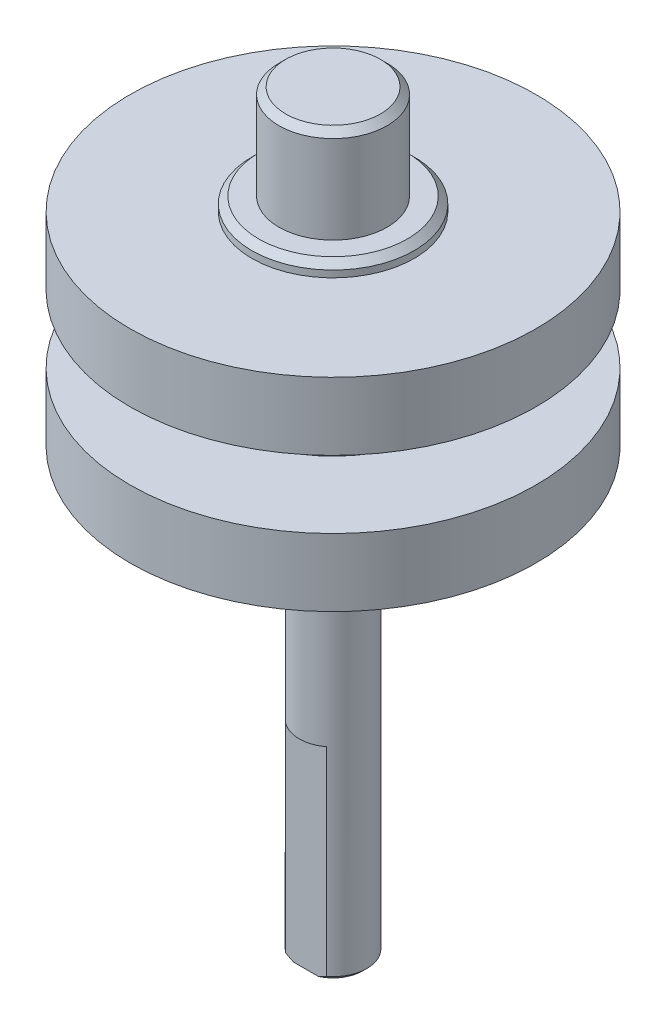
ISO-10303-21;
HEADER;
FILE_DESCRIPTION(('STEP AP214'),'2;1');
FILE_NAME('part.step','',(''),(''),'','','');
FILE_SCHEMA(('AUTOMOTIVE_DESIGN { 1 0 10303 214 1 1 1 1 }'));
ENDSEC;
DATA;
#1=APPLICATION_CONTEXT('core data for automotive mechanical design processes');
#2=APPLICATION_PROTOCOL_DEFINITION('international standard','automotive_design',2000,#1);
#3=PRODUCT_CONTEXT('',#1,'mechanical');
#4=PRODUCT('Part','Part','',(#3));
#5=PRODUCT_RELATED_PRODUCT_CATEGORY('part','',(#4));
#6=PRODUCT_DEFINITION_FORMATION('','',#4);
#7=PRODUCT_DEFINITION_CONTEXT('part definition',#1,'design');
#8=PRODUCT_DEFINITION('design','',#6,#7);
#9=PRODUCT_DEFINITION_SHAPE('','',#8);
#10=(LENGTH_UNIT() NAMED_UNIT(*) SI_UNIT(.MILLI.,.METRE.));
#11=(NAMED_UNIT(*) PLANE_ANGLE_UNIT() SI_UNIT($,.RADIAN.));
#12=(NAMED_UNIT(*) SI_UNIT($,.STERADIAN.) SOLID_ANGLE_UNIT());
#13=UNCERTAINTY_MEASURE_WITH_UNIT(LENGTH_MEASURE(1.E-05),#10,'distance_accuracy_value','');
#14=(GEOMETRIC_REPRESENTATION_CONTEXT(3) GLOBAL_UNCERTAINTY_ASSIGNED_CONTEXT((#13)) GLOBAL_UNIT_ASSIGNED_CONTEXT((#10,
#11,#12)) REPRESENTATION_CONTEXT('',''));
#15=CARTESIAN_POINT('',(0.,0.,0.));
#16=DIRECTION('',(0.,0.,1.));
#17=DIRECTION('',(1.,0.,0.));
#18=AXIS2_PLACEMENT_3D('',#15,#16,#17);
#19=CARTESIAN_POINT('',(0.,31.5,0.));
#20=DIRECTION('',(0.,1.,0.));
#21=DIRECTION('',(0.,0.,-1.));
#22=AXIS2_PLACEMENT_3D('',#19,#20,#21);
#23=PLANE('',#22);
#24=CARTESIAN_POINT('',(0.,31.5,0.));
#25=DIRECTION('',(0.,1.,0.));
#26=DIRECTION('',(0.,0.,1.));
#27=AXIS2_PLACEMENT_3D('',#24,#25,#26);
#28=CIRCLE('',#27,3.5);
#29=CARTESIAN_POINT('',(0.,31.5,3.5));
#30=VERTEX_POINT('',#29);
#31=EDGE_CURVE('E11',#30,#30,#28,.T.);
#32=ORIENTED_EDGE('',*,*,#31,.T.);
#33=EDGE_LOOP('',(#32));
#34=FACE_BOUND('',#33,.T.);
#35=ADVANCED_FACE('F17',(#34),#23,.T.);
#36=CARTESIAN_POINT('',(0.,31.5,0.));
#37=DIRECTION('',(0.,-1.,0.));
#38=DIRECTION('',(0.,0.,1.));
#39=AXIS2_PLACEMENT_3D('',#36,#37,#38);
#40=CONICAL_SURFACE('',#39,3.5,0.785398163397);
#41=DIRECTION('',(0.,-0.707106781186548,0.707106781186548));
#42=VECTOR('',#41,1.);
#43=CARTESIAN_POINT('',(0.,31.5,3.5));
#44=LINE('',#43,#42);
#45=CARTESIAN_POINT('',(0.,31.,4.));
#46=VERTEX_POINT('',#45);
#47=EDGE_CURVE('E28',#30,#46,#44,.T.);
#48=ORIENTED_EDGE('',*,*,#47,.T.);
#49=CARTESIAN_POINT('',(0.,31.,0.));
#50=DIRECTION('',(0.,1.,0.));
#51=DIRECTION('',(0.,0.,1.));
#52=AXIS2_PLACEMENT_3D('',#49,#50,#51);
#53=CIRCLE('',#52,4.);
#54=EDGE_CURVE('E228',#46,#46,#53,.T.);
#55=ORIENTED_EDGE('',*,*,#54,.T.);
#56=ORIENTED_EDGE('',*,*,#47,.F.);
#57=ORIENTED_EDGE('',*,*,#31,.F.);
#58=EDGE_LOOP('',(#48,#55,#56,#57));
#59=FACE_BOUND('',#58,.T.);
#60=ADVANCED_FACE('F318',(#59),#40,.T.);
#61=CARTESIAN_POINT('',(0.,24.5,0.));
#62=DIRECTION('',(0.,1.,0.));
#63=DIRECTION('',(0.,0.,1.));
#64=AXIS2_PLACEMENT_3D('',#61,#62,#63);
#65=CYLINDRICAL_SURFACE('',#64,4.);
#66=CARTESIAN_POINT('',(0.,24.5,0.));
#67=DIRECTION('',(0.,1.,0.));
#68=DIRECTION('',(0.,0.,1.));
#69=AXIS2_PLACEMENT_3D('',#66,#67,#68);
#70=CIRCLE('',#69,4.);
#71=CARTESIAN_POINT('',(0.,24.5,4.));
#72=VERTEX_POINT('',#71);
#73=EDGE_CURVE('E140',#72,#72,#70,.T.);
#74=ORIENTED_EDGE('',*,*,#73,.T.);
#75=DIRECTION('',(0.,1.,0.));
#76=VECTOR('',#75,1.);
#77=CARTESIAN_POINT('',(0.,24.5,4.));
#78=LINE('',#77,#76);
#79=EDGE_CURVE('E149',#72,#46,#78,.T.);
#80=ORIENTED_EDGE('',*,*,#79,.T.);
#81=ORIENTED_EDGE('',*,*,#54,.F.);
#82=ORIENTED_EDGE('',*,*,#79,.F.);
#83=EDGE_LOOP('',(#74,#80,#81,#82));
#84=FACE_BOUND('',#83,.T.);
#85=ADVANCED_FACE('F323',(#84),#65,.T.);
#86=CARTESIAN_POINT('',(0.,24.5,0.));
#87=DIRECTION('',(0.,1.,0.));
#88=DIRECTION('',(0.,0.,-1.));
#89=AXIS2_PLACEMENT_3D('',#86,#87,#88);
#90=PLANE('',#89);
#91=ORIENTED_EDGE('',*,*,#73,.F.);
#92=EDGE_LOOP('',(#91));
#93=FACE_BOUND('',#92,.T.);
#94=CARTESIAN_POINT('',(0.,24.5,0.));
#95=DIRECTION('',(0.,1.,0.));
#96=DIRECTION('',(0.,0.,1.));
#97=AXIS2_PLACEMENT_3D('',#94,#95,#96);
#98=CIRCLE('',#97,5.5);
#99=CARTESIAN_POINT('',(0.,24.5,5.5));
#100=VERTEX_POINT('',#99);
#101=EDGE_CURVE('E135',#100,#100,#98,.T.);
#102=ORIENTED_EDGE('',*,*,#101,.T.);
#103=EDGE_LOOP('',(#102));
#104=FACE_BOUND('',#103,.T.);
#105=ADVANCED_FACE('F136',(#93,#104),#90,.T.);
#106=CARTESIAN_POINT('',(0.,24.,0.));
#107=DIRECTION('',(0.,-1.,0.));
#108=DIRECTION('',(0.,0.,1.));
#109=AXIS2_PLACEMENT_3D('',#106,#107,#108);
#110=CONICAL_SURFACE('',#109,6.,0.785398163397);
#111=CARTESIAN_POINT('',(0.,24.,0.));
#112=DIRECTION('',(0.,1.,0.));
#113=DIRECTION('',(0.,0.,1.));
#114=AXIS2_PLACEMENT_3D('',#111,#112,#113);
#115=CIRCLE('',#114,6.);
#116=CARTESIAN_POINT('',(0.,24.,6.));
#117=VERTEX_POINT('',#116);
#118=EDGE_CURVE('E151',#117,#117,#115,.T.);
#119=ORIENTED_EDGE('',*,*,#118,.T.);
#120=DIRECTION('',(0.,0.707106781186548,-0.707106781186548));
#121=VECTOR('',#120,1.);
#122=CARTESIAN_POINT('',(0.,24.,6.));
#123=LINE('',#122,#121);
#124=EDGE_CURVE('E141',#117,#100,#123,.T.);
#125=ORIENTED_EDGE('',*,*,#124,.T.);
#126=ORIENTED_EDGE('',*,*,#101,.F.);
#127=ORIENTED_EDGE('',*,*,#124,.F.);
#128=EDGE_LOOP('',(#119,#125,#126,#127));
#129=FACE_BOUND('',#128,.T.);
#130=ADVANCED_FACE('F334',(#129),#110,.T.);
#131=CARTESIAN_POINT('',(0.,23.5,0.));
#132=DIRECTION('',(0.,1.,0.));
#133=DIRECTION('',(0.,0.,1.));
#134=AXIS2_PLACEMENT_3D('',#131,#132,#133);
#135=CYLINDRICAL_SURFACE('',#134,6.);
#136=CARTESIAN_POINT('',(0.,23.5,0.));
#137=DIRECTION('',(0.,1.,0.));
#138=DIRECTION('',(0.,0.,1.));
#139=AXIS2_PLACEMENT_3D('',#136,#137,#138);
#140=CIRCLE('',#139,6.);
#141=CARTESIAN_POINT('',(0.,23.5,6.));
#142=VERTEX_POINT('',#141);
#143=EDGE_CURVE('E274',#142,#142,#140,.T.);
#144=ORIENTED_EDGE('',*,*,#143,.T.);
#145=DIRECTION('',(0.,1.,0.));
#146=VECTOR('',#145,1.);
#147=CARTESIAN_POINT('',(0.,23.5,6.));
#148=LINE('',#147,#146);
#149=EDGE_CURVE('E21',#142,#117,#148,.T.);
#150=ORIENTED_EDGE('',*,*,#149,.T.);
#151=ORIENTED_EDGE('',*,*,#118,.F.);
#152=ORIENTED_EDGE('',*,*,#149,.F.);
#153=EDGE_LOOP('',(#144,#150,#151,#152));
#154=FACE_BOUND('',#153,.T.);
#155=ADVANCED_FACE('F330',(#154),#135,.T.);
#156=CARTESIAN_POINT('',(0.,23.5,0.));
#157=DIRECTION('',(0.,1.,0.));
#158=DIRECTION('',(0.,0.,-1.));
#159=AXIS2_PLACEMENT_3D('',#156,#157,#158);
#160=PLANE('',#159);
#161=ORIENTED_EDGE('',*,*,#143,.F.);
#162=EDGE_LOOP('',(#161));
#163=FACE_BOUND('',#162,.T.);
#164=CARTESIAN_POINT('',(0.,23.5,0.));
#165=DIRECTION('',(0.,1.,0.));
#166=DIRECTION('',(0.,0.,1.));
#167=AXIS2_PLACEMENT_3D('',#164,#165,#166);
#168=CIRCLE('',#167,15.);
#169=CARTESIAN_POINT('',(0.,23.5,15.));
#170=VERTEX_POINT('',#169);
#171=EDGE_CURVE('E155',#170,#170,#168,.T.);
#172=ORIENTED_EDGE('',*,*,#171,.T.);
#173=EDGE_LOOP('',(#172));
#174=FACE_BOUND('',#173,.T.);
#175=ADVANCED_FACE('F333',(#163,#174),#160,.T.);
#176=CARTESIAN_POINT('',(0.,18.5,0.));
#177=DIRECTION('',(0.,1.,0.));
#178=DIRECTION('',(0.,0.,1.));
#179=AXIS2_PLACEMENT_3D('',#176,#177,#178);
#180=CYLINDRICAL_SURFACE('',#179,15.);
#181=CARTESIAN_POINT('',(0.,18.5,0.));
#182=DIRECTION('',(0.,1.,0.));
#183=DIRECTION('',(0.,0.,1.));
#184=AXIS2_PLACEMENT_3D('',#181,#182,#183);
#185=CIRCLE('',#184,15.);
#186=CARTESIAN_POINT('',(0.,18.5,15.));
#187=VERTEX_POINT('',#186);
#188=EDGE_CURVE('E185',#187,#187,#185,.T.);
#189=ORIENTED_EDGE('',*,*,#188,.T.);
#190=DIRECTION('',(0.,1.,0.));
#191=VECTOR('',#190,1.);
#192=CARTESIAN_POINT('',(0.,18.5,15.));
#193=LINE('',#192,#191);
#194=EDGE_CURVE('E189',#187,#170,#193,.T.);
#195=ORIENTED_EDGE('',*,*,#194,.T.);
#196=ORIENTED_EDGE('',*,*,#171,.F.);
#197=ORIENTED_EDGE('',*,*,#194,.F.);
#198=EDGE_LOOP('',(#189,#195,#196,#197));
#199=FACE_BOUND('',#198,.T.);
#200=ADVANCED_FACE('F328',(#199),#180,.T.);
#201=CARTESIAN_POINT('',(0.,18.5,0.));
#202=DIRECTION('',(0.,1.,0.));
#203=DIRECTION('',(0.,0.,-1.));
#204=AXIS2_PLACEMENT_3D('',#201,#202,#203);
#205=PLANE('',#204);
#206=CARTESIAN_POINT('',(0.,18.5,0.));
#207=DIRECTION('',(0.,1.,0.));
#208=DIRECTION('',(0.,0.,1.));
#209=AXIS2_PLACEMENT_3D('',#206,#207,#208);
#210=CIRCLE('',#209,8.);
#211=CARTESIAN_POINT('',(0.,18.5,8.));
#212=VERTEX_POINT('',#211);
#213=EDGE_CURVE('E184',#212,#212,#210,.T.);
#214=ORIENTED_EDGE('',*,*,#213,.T.);
#215=EDGE_LOOP('',(#214));
#216=FACE_BOUND('',#215,.T.);
#217=ORIENTED_EDGE('',*,*,#188,.F.);
#218=EDGE_LOOP('',(#217));
#219=FACE_BOUND('',#218,.T.);
#220=ADVANCED_FACE('F346',(#216,#219),#205,.F.);
#221=CARTESIAN_POINT('',(0.,18.5,0.));
#222=DIRECTION('',(0.,-1.,0.));
#223=DIRECTION('',(0.,0.,1.));
#224=AXIS2_PLACEMENT_3D('',#221,#222,#223);
#225=CYLINDRICAL_SURFACE('',#224,8.);
#226=DIRECTION('',(0.,-1.,0.));
#227=VECTOR('',#226,1.);
#228=CARTESIAN_POINT('',(0.,18.5,8.));
#229=LINE('',#228,#227);
#230=CARTESIAN_POINT('',(0.,13.5,8.));
#231=VERTEX_POINT('',#230);
#232=EDGE_CURVE('E176',#212,#231,#229,.T.);
#233=ORIENTED_EDGE('',*,*,#232,.T.);
#234=CARTESIAN_POINT('',(0.,13.5,0.));
#235=DIRECTION('',(0.,1.,0.));
#236=DIRECTION('',(0.,0.,1.));
#237=AXIS2_PLACEMENT_3D('',#234,#235,#236);
#238=CIRCLE('',#237,8.);
#239=EDGE_CURVE('E172',#231,#231,#238,.T.);
#240=ORIENTED_EDGE('',*,*,#239,.T.);
#241=ORIENTED_EDGE('',*,*,#232,.F.);
#242=ORIENTED_EDGE('',*,*,#213,.F.);
#243=EDGE_LOOP('',(#233,#240,#241,#242));
#244=FACE_BOUND('',#243,.T.);
#245=ADVANCED_FACE('F483',(#244),#225,.T.);
#246=CARTESIAN_POINT('',(0.,13.5,0.));
#247=DIRECTION('',(0.,-1.,0.));
#248=DIRECTION('',(-1.,0.,0.));
#249=AXIS2_PLACEMENT_3D('',#246,#247,#248);
#250=PLANE('',#249);
#251=CARTESIAN_POINT('',(0.,13.5,0.));
#252=DIRECTION('',(0.,1.,0.));
#253=DIRECTION('',(0.,0.,1.));
#254=AXIS2_PLACEMENT_3D('',#251,#252,#253);
#255=CIRCLE('',#254,15.);
#256=CARTESIAN_POINT('',(0.,13.5,15.));
#257=VERTEX_POINT('',#256);
#258=EDGE_CURVE('E177',#257,#257,#255,.T.);
#259=ORIENTED_EDGE('',*,*,#258,.T.);
#260=EDGE_LOOP('',(#259));
#261=FACE_BOUND('',#260,.T.);
#262=ORIENTED_EDGE('',*,*,#239,.F.);
#263=EDGE_LOOP('',(#262));
#264=FACE_BOUND('',#263,.T.);
#265=ADVANCED_FACE('F485',(#261,#264),#250,.F.);
#266=CARTESIAN_POINT('',(0.,8.5,0.));
#267=DIRECTION('',(0.,1.,0.));
#268=DIRECTION('',(0.,0.,1.));
#269=AXIS2_PLACEMENT_3D('',#266,#267,#268);
#270=CYLINDRICAL_SURFACE('',#269,15.);
#271=CARTESIAN_POINT('',(0.,8.5,0.));
#272=DIRECTION('',(0.,1.,0.));
#273=DIRECTION('',(0.,0.,1.));
#274=AXIS2_PLACEMENT_3D('',#271,#272,#273);
#275=CIRCLE('',#274,15.);
#276=CARTESIAN_POINT('',(0.,8.5,15.));
#277=VERTEX_POINT('',#276);
#278=EDGE_CURVE('E181',#277,#277,#275,.T.);
#279=ORIENTED_EDGE('',*,*,#278,.T.);
#280=DIRECTION('',(0.,1.,0.));
#281=VECTOR('',#280,1.);
#282=CARTESIAN_POINT('',(0.,8.5,15.));
#283=LINE('',#282,#281);
#284=EDGE_CURVE('E250',#277,#257,#283,.T.);
#285=ORIENTED_EDGE('',*,*,#284,.T.);
#286=ORIENTED_EDGE('',*,*,#258,.F.);
#287=ORIENTED_EDGE('',*,*,#284,.F.);
#288=EDGE_LOOP('',(#279,#285,#286,#287));
#289=FACE_BOUND('',#288,.T.);
#290=ADVANCED_FACE('F19',(#289),#270,.T.);
#291=CARTESIAN_POINT('',(0.,8.5,0.));
#292=DIRECTION('',(0.,-1.,0.));
#293=DIRECTION('',(-1.,0.,0.));
#294=AXIS2_PLACEMENT_3D('',#291,#292,#293);
#295=PLANE('',#294);
#296=ORIENTED_EDGE('',*,*,#278,.F.);
#297=EDGE_LOOP('',(#296));
#298=FACE_BOUND('',#297,.T.);
#299=CARTESIAN_POINT('',(0.,8.5,0.));
#300=DIRECTION('',(0.,1.,0.));
#301=DIRECTION('',(0.,0.,1.));
#302=AXIS2_PLACEMENT_3D('',#299,#300,#301);
#303=CIRCLE('',#302,6.);
#304=CARTESIAN_POINT('',(0.,8.5,6.));
#305=VERTEX_POINT('',#304);
#306=EDGE_CURVE('E178',#305,#305,#303,.T.);
#307=ORIENTED_EDGE('',*,*,#306,.T.);
#308=EDGE_LOOP('',(#307));
#309=FACE_BOUND('',#308,.T.);
#310=ADVANCED_FACE('F298',(#298,#309),#295,.T.);
#311=CARTESIAN_POINT('',(0.,8.,0.));
#312=DIRECTION('',(0.,1.,0.));
#313=DIRECTION('',(0.,0.,1.));
#314=AXIS2_PLACEMENT_3D('',#311,#312,#313);
#315=CYLINDRICAL_SURFACE('',#314,6.);
#316=CARTESIAN_POINT('',(0.,8.,0.));
#317=DIRECTION('',(0.,1.,0.));
#318=DIRECTION('',(0.,0.,1.));
#319=AXIS2_PLACEMENT_3D('',#316,#317,#318);
#320=CIRCLE('',#319,6.);
#321=CARTESIAN_POINT('',(0.,8.,6.));
#322=VERTEX_POINT('',#321);
#323=EDGE_CURVE('E163',#322,#322,#320,.T.);
#324=ORIENTED_EDGE('',*,*,#323,.T.);
#325=DIRECTION('',(0.,1.,0.));
#326=VECTOR('',#325,1.);
#327=CARTESIAN_POINT('',(0.,8.,6.));
#328=LINE('',#327,#326);
#329=EDGE_CURVE('E96',#322,#305,#328,.T.);
#330=ORIENTED_EDGE('',*,*,#329,.T.);
#331=ORIENTED_EDGE('',*,*,#306,.F.);
#332=ORIENTED_EDGE('',*,*,#329,.F.);
#333=EDGE_LOOP('',(#324,#330,#331,#332));
#334=FACE_BOUND('',#333,.T.);
#335=ADVANCED_FACE('F301',(#334),#315,.T.);
#336=CARTESIAN_POINT('',(0.,7.5,0.));
#337=DIRECTION('',(0.,1.,0.));
#338=DIRECTION('',(0.,0.,1.));
#339=AXIS2_PLACEMENT_3D('',#336,#337,#338);
#340=CONICAL_SURFACE('',#339,5.5,0.785398163397);
#341=CARTESIAN_POINT('',(0.,7.5,0.));
#342=DIRECTION('',(0.,1.,0.));
#343=DIRECTION('',(0.,0.,1.));
#344=AXIS2_PLACEMENT_3D('',#341,#342,#343);
#345=CIRCLE('',#344,5.5);
#346=CARTESIAN_POINT('',(0.,7.5,5.5));
#347=VERTEX_POINT('',#346);
#348=EDGE_CURVE('E230',#347,#347,#345,.T.);
#349=ORIENTED_EDGE('',*,*,#348,.T.);
#350=DIRECTION('',(0.,0.707106781186548,0.707106781186548));
#351=VECTOR('',#350,1.);
#352=CARTESIAN_POINT('',(0.,7.5,5.5));
#353=LINE('',#352,#351);
#354=EDGE_CURVE('E109',#347,#322,#353,.T.);
#355=ORIENTED_EDGE('',*,*,#354,.T.);
#356=ORIENTED_EDGE('',*,*,#323,.F.);
#357=ORIENTED_EDGE('',*,*,#354,.F.);
#358=EDGE_LOOP('',(#349,#355,#356,#357));
#359=FACE_BOUND('',#358,.T.);
#360=ADVANCED_FACE('F303',(#359),#340,.T.);
#361=CARTESIAN_POINT('',(0.,7.5,0.));
#362=DIRECTION('',(0.,-1.,0.));
#363=DIRECTION('',(-1.,0.,0.));
#364=AXIS2_PLACEMENT_3D('',#361,#362,#363);
#365=PLANE('',#364);
#366=ORIENTED_EDGE('',*,*,#348,.F.);
#367=EDGE_LOOP('',(#366));
#368=FACE_BOUND('',#367,.T.);
#369=CARTESIAN_POINT('',(0.,7.5,0.));
#370=DIRECTION('',(0.,1.,0.));
#371=DIRECTION('',(0.,0.,1.));
#372=AXIS2_PLACEMENT_3D('',#369,#370,#371);
#373=CIRCLE('',#372,4.);
#374=CARTESIAN_POINT('',(0.,7.5,4.));
#375=VERTEX_POINT('',#374);
#376=EDGE_CURVE('E226',#375,#375,#373,.T.);
#377=ORIENTED_EDGE('',*,*,#376,.T.);
#378=EDGE_LOOP('',(#377));
#379=FACE_BOUND('',#378,.T.);
#380=ADVANCED_FACE('F305',(#368,#379),#365,.T.);
#381=CARTESIAN_POINT('',(0.,1.,0.));
#382=DIRECTION('',(0.,1.,0.));
#383=DIRECTION('',(0.,0.,1.));
#384=AXIS2_PLACEMENT_3D('',#381,#382,#383);
#385=CYLINDRICAL_SURFACE('',#384,4.);
#386=CARTESIAN_POINT('',(0.,1.,0.));
#387=DIRECTION('',(0.,1.,0.));
#388=DIRECTION('',(0.,0.,1.));
#389=AXIS2_PLACEMENT_3D('',#386,#387,#388);
#390=CIRCLE('',#389,4.);
#391=CARTESIAN_POINT('',(0.,1.,4.));
#392=VERTEX_POINT('',#391);
#393=EDGE_CURVE('E209',#392,#392,#390,.T.);
#394=ORIENTED_EDGE('',*,*,#393,.T.);
#395=DIRECTION('',(0.,1.,0.));
#396=VECTOR('',#395,1.);
#397=CARTESIAN_POINT('',(0.,1.,4.));
#398=LINE('',#397,#396);
#399=EDGE_CURVE('E222',#392,#375,#398,.T.);
#400=ORIENTED_EDGE('',*,*,#399,.T.);
#401=ORIENTED_EDGE('',*,*,#376,.F.);
#402=ORIENTED_EDGE('',*,*,#399,.F.);
#403=EDGE_LOOP('',(#394,#400,#401,#402));
#404=FACE_BOUND('',#403,.T.);
#405=ADVANCED_FACE('F312',(#404),#385,.T.);
#406=CARTESIAN_POINT('',(0.,0.5,0.));
#407=DIRECTION('',(0.,1.,0.));
#408=DIRECTION('',(0.,0.,1.));
#409=AXIS2_PLACEMENT_3D('',#406,#407,#408);
#410=CONICAL_SURFACE('',#409,3.5,0.785398163397);
#411=CARTESIAN_POINT('',(0.,0.5,0.));
#412=DIRECTION('',(0.,1.,0.));
#413=DIRECTION('',(0.,0.,1.));
#414=AXIS2_PLACEMENT_3D('',#411,#412,#413);
#415=CIRCLE('',#414,3.5);
#416=CARTESIAN_POINT('',(0.,0.5,3.5));
#417=VERTEX_POINT('',#416);
#418=EDGE_CURVE('E157',#417,#417,#415,.T.);
#419=ORIENTED_EDGE('',*,*,#418,.T.);
#420=DIRECTION('',(0.,0.707106781186548,0.707106781186548));
#421=VECTOR('',#420,1.);
#422=CARTESIAN_POINT('',(0.,0.5,3.5));
#423=LINE('',#422,#421);
#424=EDGE_CURVE('E161',#417,#392,#423,.T.);
#425=ORIENTED_EDGE('',*,*,#424,.T.);
#426=ORIENTED_EDGE('',*,*,#393,.F.);
#427=ORIENTED_EDGE('',*,*,#424,.F.);
#428=EDGE_LOOP('',(#419,#425,#426,#427));
#429=FACE_BOUND('',#428,.T.);
#430=ADVANCED_FACE('F487',(#429),#410,.T.);
#431=CARTESIAN_POINT('',(0.,0.5,0.));
#432=DIRECTION('',(0.,-1.,0.));
#433=DIRECTION('',(-1.,0.,0.));
#434=AXIS2_PLACEMENT_3D('',#431,#432,#433);
#435=PLANE('',#434);
#436=ORIENTED_EDGE('',*,*,#418,.F.);
#437=EDGE_LOOP('',(#436));
#438=FACE_BOUND('',#437,.T.);
#439=CARTESIAN_POINT('',(0.,0.5,0.));
#440=DIRECTION('',(0.,1.,0.));
#441=DIRECTION('',(0.,0.,1.));
#442=AXIS2_PLACEMENT_3D('',#439,#440,#441);
#443=CIRCLE('',#442,2.5);
#444=CARTESIAN_POINT('',(0.,0.5,2.5));
#445=VERTEX_POINT('',#444);
#446=EDGE_CURVE('E216',#445,#445,#443,.T.);
#447=ORIENTED_EDGE('',*,*,#446,.T.);
#448=EDGE_LOOP('',(#447));
#449=FACE_BOUND('',#448,.T.);
#450=ADVANCED_FACE('F461',(#438,#449),#435,.T.);
#451=CARTESIAN_POINT('',(0.,-9.,2.25));
#452=DIRECTION('',(0.,1.,0.));
#453=DIRECTION('',(0.,0.,-1.));
#454=AXIS2_PLACEMENT_3D('',#451,#452,#453);
#455=PLANE('',#454);
#456=CARTESIAN_POINT('',(0.,-9.,0.));
#457=DIRECTION('',(0.,1.,0.));
#458=DIRECTION('',(0.,0.,1.));
#459=AXIS2_PLACEMENT_3D('',#456,#457,#458);
#460=CIRCLE('',#459,2.5);
#461=CARTESIAN_POINT('',(0.,-9.,2.5));
#462=VERTEX_POINT('',#461);
#463=CARTESIAN_POINT('',(1.5,-9.,2.));
#464=VERTEX_POINT('',#463);
#465=EDGE_CURVE('E162',#462,#464,#460,.T.);
#466=ORIENTED_EDGE('',*,*,#465,.F.);
#467=CARTESIAN_POINT('',(0.,-9.,0.));
#468=DIRECTION('',(0.,1.,0.));
#469=DIRECTION('',(0.,0.,1.));
#470=AXIS2_PLACEMENT_3D('',#467,#468,#469);
#471=CIRCLE('',#470,2.5);
#472=CARTESIAN_POINT('',(-1.5,-9.,2.));
#473=VERTEX_POINT('',#472);
#474=EDGE_CURVE('E253',#473,#462,#471,.T.);
#475=ORIENTED_EDGE('',*,*,#474,.F.);
#476=DIRECTION('',(-1.,0.,0.));
#477=VECTOR('',#476,1.);
#478=CARTESIAN_POINT('',(2.,-9.,2.));
#479=LINE('',#478,#477);
#480=EDGE_CURVE('E170',#464,#473,#479,.T.);
#481=ORIENTED_EDGE('',*,*,#480,.F.);
#482=EDGE_LOOP('',(#466,#475,#481));
#483=FACE_BOUND('',#482,.T.);
#484=ADVANCED_FACE('F468',(#483),#455,.F.);
#485=CARTESIAN_POINT('',(0.,-23.7,0.));
#486=DIRECTION('',(0.,1.,0.));
#487=DIRECTION('',(0.,0.,1.));
#488=AXIS2_PLACEMENT_3D('',#485,#486,#487);
#489=CYLINDRICAL_SURFACE('',#488,2.5);
#490=DIRECTION('',(0.,1.,0.));
#491=VECTOR('',#490,1.);
#492=CARTESIAN_POINT('',(1.5,-23.7,2.));
#493=LINE('',#492,#491);
#494=CARTESIAN_POINT('',(1.5,-23.7,2.));
#495=VERTEX_POINT('',#494);
#496=EDGE_CURVE('E166',#495,#464,#493,.T.);
#497=ORIENTED_EDGE('',*,*,#496,.F.);
#498=CARTESIAN_POINT('',(0.,-23.7,0.));
#499=DIRECTION('',(0.,1.,0.));
#500=DIRECTION('',(0.,0.,1.));
#501=AXIS2_PLACEMENT_3D('',#498,#499,#500);
#502=CIRCLE('',#501,2.5);
#503=CARTESIAN_POINT('',(-1.5,-23.7,2.));
#504=VERTEX_POINT('',#503);
#505=EDGE_CURVE('E198',#495,#504,#502,.T.);
#506=ORIENTED_EDGE('',*,*,#505,.T.);
#507=DIRECTION('',(0.,1.,0.));
#508=VECTOR('',#507,1.);
#509=CARTESIAN_POINT('',(-1.5,-23.7,2.));
#510=LINE('',#509,#508);
#511=EDGE_CURVE('E171',#504,#473,#510,.T.);
#512=ORIENTED_EDGE('',*,*,#511,.T.);
#513=ORIENTED_EDGE('',*,*,#474,.T.);
#514=DIRECTION('',(0.,1.,0.));
#515=VECTOR('',#514,1.);
#516=CARTESIAN_POINT('',(0.,-23.7,2.5));
#517=LINE('',#516,#515);
#518=EDGE_CURVE('E256',#462,#445,#517,.T.);
#519=ORIENTED_EDGE('',*,*,#518,.T.);
#520=ORIENTED_EDGE('',*,*,#446,.F.);
#521=ORIENTED_EDGE('',*,*,#518,.F.);
#522=ORIENTED_EDGE('',*,*,#465,.T.);
#523=EDGE_LOOP('',(#497,#506,#512,#513,#519,#520,#521,#522));
#524=FACE_BOUND('',#523,.T.);
#525=ADVANCED_FACE('F340',(#524),#489,.T.);
#526=CARTESIAN_POINT('',(2.,-9.,2.));
#527=DIRECTION('',(0.,0.,-1.));
#528=DIRECTION('',(0.,-1.,0.));
#529=AXIS2_PLACEMENT_3D('',#526,#527,#528);
#530=PLANE('',#529);
#531=ORIENTED_EDGE('',*,*,#511,.F.);
#532=CARTESIAN_POINT('',(-1.5,-23.7,2.));
#533=CARTESIAN_POINT('',(-1.18963571222917,-23.8862185726625,2.));
#534=CARTESIAN_POINT('',(-0.916515138990876,-24.,2.));
#535=(BOUNDED_CURVE() B_SPLINE_CURVE(2,(#532,#533,#534),.UNSPECIFIED.,.F.,
.F.) B_SPLINE_CURVE_WITH_KNOTS((3,3),(0.,1.),
.UNSPECIFIED.) CURVE() GEOMETRIC_REPRESENTATION_ITEM() RATIONAL_B_SPLINE_CURVE((1.,
1.00779631445989,1.)) REPRESENTATION_ITEM(''));
#536=CARTESIAN_POINT('',(-0.916515138991,-24.,2.));
#537=VERTEX_POINT('',#536);
#538=EDGE_CURVE('E193',#504,#537,#535,.T.);
#539=ORIENTED_EDGE('',*,*,#538,.T.);
#540=DIRECTION('',(1.,0.,0.));
#541=VECTOR('',#540,1.);
#542=CARTESIAN_POINT('',(1.,-24.,2.));
#543=LINE('',#542,#541);
#544=CARTESIAN_POINT('',(0.916515138991,-24.,2.));
#545=VERTEX_POINT('',#544);
#546=EDGE_CURVE('E271',#537,#545,#543,.T.);
#547=ORIENTED_EDGE('',*,*,#546,.T.);
#548=CARTESIAN_POINT('',(0.916515138991047,-24.,2.));
#549=CARTESIAN_POINT('',(1.18963571222927,-23.8862185726625,2.));
#550=CARTESIAN_POINT('',(1.5,-23.7,2.));
#551=(BOUNDED_CURVE() B_SPLINE_CURVE(2,(#548,#549,#550),.UNSPECIFIED.,.F.,
.F.) B_SPLINE_CURVE_WITH_KNOTS((3,3),(0.,1.),
.UNSPECIFIED.) CURVE() GEOMETRIC_REPRESENTATION_ITEM() RATIONAL_B_SPLINE_CURVE((1.,
1.00779631446006,1.)) REPRESENTATION_ITEM(''));
#552=EDGE_CURVE('E199',#545,#495,#551,.T.);
#553=ORIENTED_EDGE('',*,*,#552,.T.);
#554=ORIENTED_EDGE('',*,*,#496,.T.);
#555=ORIENTED_EDGE('',*,*,#480,.T.);
#556=EDGE_LOOP('',(#531,#539,#547,#553,#554,#555));
#557=FACE_BOUND('',#556,.T.);
#558=ADVANCED_FACE('F336',(#557),#530,.F.);
#559=CARTESIAN_POINT('',(0.,-24.,0.));
#560=DIRECTION('',(0.,1.,0.));
#561=DIRECTION('',(0.,0.,1.));
#562=AXIS2_PLACEMENT_3D('',#559,#560,#561);
#563=CONICAL_SURFACE('',#562,2.2,0.785398163397);
#564=ORIENTED_EDGE('',*,*,#552,.F.);
#565=CARTESIAN_POINT('',(0.,-24.,0.));
#566=DIRECTION('',(0.,1.,0.));
#567=DIRECTION('',(0.,0.,1.));
#568=AXIS2_PLACEMENT_3D('',#565,#566,#567);
#569=CIRCLE('',#568,2.2);
#570=EDGE_CURVE('E278',#545,#537,#569,.T.);
#571=ORIENTED_EDGE('',*,*,#570,.T.);
#572=ORIENTED_EDGE('',*,*,#538,.F.);
#573=ORIENTED_EDGE('',*,*,#505,.F.);
#574=EDGE_LOOP('',(#564,#571,#572,#573));
#575=FACE_BOUND('',#574,.T.);
#576=ADVANCED_FACE('F339',(#575),#563,.T.);
#577=CARTESIAN_POINT('',(0.,-24.,0.));
#578=DIRECTION('',(0.,-1.,0.));
#579=DIRECTION('',(-1.,0.,0.));
#580=AXIS2_PLACEMENT_3D('',#577,#578,#579);
#581=PLANE('',#580);
#582=ORIENTED_EDGE('',*,*,#570,.F.);
#583=ORIENTED_EDGE('',*,*,#546,.F.);
#584=EDGE_LOOP('',(#582,#583));
#585=FACE_BOUND('',#584,.T.);
#586=ADVANCED_FACE('F399',(#585),#581,.T.);
#587=CLOSED_SHELL('',(#35,#60,#85,#105,#130,#155,#175,#200,#220,#245,#265,#290,#310,#335,#360,
#380,#405,#430,#450,#484,#525,#558,#576,#586));
#588=MANIFOLD_SOLID_BREP('B1',#587);
#589=ADVANCED_BREP_SHAPE_REPRESENTATION('',(#18,#588),#14);
#590=SHAPE_DEFINITION_REPRESENTATION(#9,#589);
ENDSEC;
END-ISO-10303-21;
